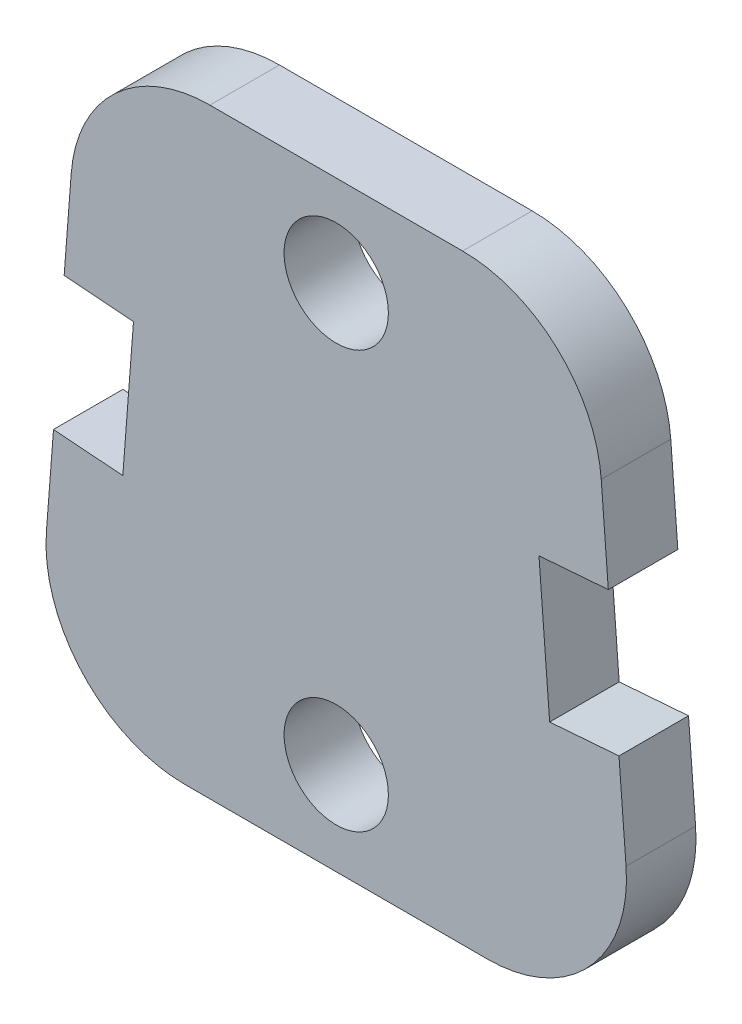
ISO-10303-21;
HEADER;
FILE_DESCRIPTION(('STEP AP214'),'2;1');
FILE_NAME('part.step','',(''),(''),'','','');
FILE_SCHEMA(('AUTOMOTIVE_DESIGN { 1 0 10303 214 1 1 1 1 }'));
ENDSEC;
DATA;
#1=APPLICATION_CONTEXT('core data for automotive mechanical design processes');
#2=APPLICATION_PROTOCOL_DEFINITION('international standard','automotive_design',2000,#1);
#3=PRODUCT_CONTEXT('',#1,'mechanical');
#4=PRODUCT('Part','Part','',(#3));
#5=PRODUCT_RELATED_PRODUCT_CATEGORY('part','',(#4));
#6=PRODUCT_DEFINITION_FORMATION('','',#4);
#7=PRODUCT_DEFINITION_CONTEXT('part definition',#1,'design');
#8=PRODUCT_DEFINITION('design','',#6,#7);
#9=PRODUCT_DEFINITION_SHAPE('','',#8);
#10=(LENGTH_UNIT() NAMED_UNIT(*) SI_UNIT(.MILLI.,.METRE.));
#11=(NAMED_UNIT(*) PLANE_ANGLE_UNIT() SI_UNIT($,.RADIAN.));
#12=(NAMED_UNIT(*) SI_UNIT($,.STERADIAN.) SOLID_ANGLE_UNIT());
#13=UNCERTAINTY_MEASURE_WITH_UNIT(LENGTH_MEASURE(1.E-05),#10,'distance_accuracy_value','');
#14=(GEOMETRIC_REPRESENTATION_CONTEXT(3) GLOBAL_UNCERTAINTY_ASSIGNED_CONTEXT((#13)) GLOBAL_UNIT_ASSIGNED_CONTEXT((#10,
#11,#12)) REPRESENTATION_CONTEXT('',''));
#15=CARTESIAN_POINT('',(0.,0.,0.));
#16=DIRECTION('',(0.,0.,1.));
#17=DIRECTION('',(1.,0.,0.));
#18=AXIS2_PLACEMENT_3D('',#15,#16,#17);
#19=CARTESIAN_POINT('',(-15.7816176470588,1.21397058823529,3.175));
#20=DIRECTION('',(-0.997054485501582,0.076696498884737,0.));
#21=DIRECTION('',(-0.076696498884737,-0.997054485501582,0.));
#22=AXIS2_PLACEMENT_3D('',#19,#20,#21);
#23=PLANE('',#22);
#24=DIRECTION('',(0.0766964988847371,0.997054485501582,0.));
#25=VECTOR('',#24,1.);
#26=CARTESIAN_POINT('',(-15.7816176470588,1.21397058823529,3.175));
#27=LINE('',#26,#25);
#28=CARTESIAN_POINT('',(-13.2324085050319,34.3536894345848,3.175));
#29=VERTEX_POINT('',#28);
#30=CARTESIAN_POINT('',(-12.9093045043756,38.5540414431172,3.175));
#31=VERTEX_POINT('',#30);
#32=EDGE_CURVE('E208',#29,#31,#27,.T.);
#33=ORIENTED_EDGE('',*,*,#32,.T.);
#34=DIRECTION('',(0.,0.,-1.));
#35=VECTOR('',#34,1.);
#36=CARTESIAN_POINT('',(-12.9093045043756,38.5540414431172,3.175));
#37=LINE('',#36,#35);
#38=CARTESIAN_POINT('',(-12.9093045043756,38.5540414431172,0.));
#39=VERTEX_POINT('',#38);
#40=EDGE_CURVE('E160',#31,#39,#37,.T.);
#41=ORIENTED_EDGE('',*,*,#40,.T.);
#42=DIRECTION('',(0.0766964988847371,0.997054485501582,0.));
#43=VECTOR('',#42,1.);
#44=CARTESIAN_POINT('',(-15.7816176470588,1.21397058823529,0.));
#45=LINE('',#44,#43);
#46=CARTESIAN_POINT('',(-13.2324085050319,34.3536894345848,0.));
#47=VERTEX_POINT('',#46);
#48=EDGE_CURVE('E239',#47,#39,#45,.T.);
#49=ORIENTED_EDGE('',*,*,#48,.F.);
#50=DIRECTION('',(0.,0.,-1.));
#51=VECTOR('',#50,1.);
#52=CARTESIAN_POINT('',(-13.2324085050319,34.3536894345848,3.175));
#53=LINE('',#52,#51);
#54=EDGE_CURVE('E268',#29,#47,#53,.T.);
#55=ORIENTED_EDGE('',*,*,#54,.F.);
#56=EDGE_LOOP('',(#33,#41,#49,#55));
#57=FACE_BOUND('',#56,.T.);
#58=ADVANCED_FACE('F33',(#57),#23,.T.);
#59=CARTESIAN_POINT('',(15.7816176470588,1.21397058823529,3.175));
#60=DIRECTION('',(0.997054485501582,0.0766964988847369,0.));
#61=DIRECTION('',(-0.0766964988847369,0.997054485501582,0.));
#62=AXIS2_PLACEMENT_3D('',#59,#60,#61);
#63=PLANE('',#62);
#64=DIRECTION('',(0.0766964988847369,-0.997054485501582,0.));
#65=VECTOR('',#64,1.);
#66=CARTESIAN_POINT('',(15.7816176470588,1.21397058823529,0.));
#67=LINE('',#66,#65);
#68=CARTESIAN_POINT('',(12.909304504375,38.5540414431171,0.));
#69=VERTEX_POINT('',#68);
#70=CARTESIAN_POINT('',(13.2324085050319,34.3536894345848,0.));
#71=VERTEX_POINT('',#70);
#72=EDGE_CURVE('E251',#69,#71,#67,.T.);
#73=ORIENTED_EDGE('',*,*,#72,.F.);
#74=DIRECTION('',(0.,0.,-1.));
#75=VECTOR('',#74,1.);
#76=CARTESIAN_POINT('',(12.909304504375,38.5540414431171,3.17500000000002));
#77=LINE('',#76,#75);
#78=CARTESIAN_POINT('',(12.909304504375,38.5540414431171,3.17500000000002));
#79=VERTEX_POINT('',#78);
#80=EDGE_CURVE('E177',#79,#69,#77,.T.);
#81=ORIENTED_EDGE('',*,*,#80,.F.);
#82=DIRECTION('',(0.0766964988847369,-0.997054485501582,0.));
#83=VECTOR('',#82,1.);
#84=CARTESIAN_POINT('',(15.7816176470588,1.21397058823529,3.175));
#85=LINE('',#84,#83);
#86=CARTESIAN_POINT('',(13.2324085050319,34.3536894345848,3.175));
#87=VERTEX_POINT('',#86);
#88=EDGE_CURVE('E220',#79,#87,#85,.T.);
#89=ORIENTED_EDGE('',*,*,#88,.T.);
#90=DIRECTION('',(0.,0.,-1.));
#91=VECTOR('',#90,1.);
#92=CARTESIAN_POINT('',(13.2324085050319,34.3536894345848,3.175));
#93=LINE('',#92,#91);
#94=EDGE_CURVE('E260',#87,#71,#93,.T.);
#95=ORIENTED_EDGE('',*,*,#94,.T.);
#96=EDGE_LOOP('',(#73,#81,#89,#95));
#97=FACE_BOUND('',#96,.T.);
#98=ADVANCED_FACE('F296',(#97),#63,.T.);
#99=CARTESIAN_POINT('',(0.,54.9486666666667,3.175));
#100=DIRECTION('',(0.,1.,0.));
#101=DIRECTION('',(-1.,0.,0.));
#102=AXIS2_PLACEMENT_3D('',#99,#100,#101);
#103=PLANE('',#102);
#104=DIRECTION('',(1.,0.,0.));
#105=VECTOR('',#104,1.);
#106=CARTESIAN_POINT('',(0.,54.9486666666667,0.));
#107=LINE('',#106,#105);
#108=CARTESIAN_POINT('',(-5.76788175286608,54.9486666666667,0.));
#109=VERTEX_POINT('',#108);
#110=CARTESIAN_POINT('',(5.7678817528661,54.9486666666667,0.));
#111=VERTEX_POINT('',#110);
#112=EDGE_CURVE('E232',#109,#111,#107,.T.);
#113=ORIENTED_EDGE('',*,*,#112,.F.);
#114=DIRECTION('',(0.,0.,-1.));
#115=VECTOR('',#114,1.);
#116=CARTESIAN_POINT('',(-5.76788175286608,54.9486666666667,3.175));
#117=LINE('',#116,#115);
#118=CARTESIAN_POINT('',(-5.76788175286608,54.9486666666667,3.175));
#119=VERTEX_POINT('',#118);
#120=EDGE_CURVE('E273',#119,#109,#117,.T.);
#121=ORIENTED_EDGE('',*,*,#120,.F.);
#122=DIRECTION('',(1.,0.,0.));
#123=VECTOR('',#122,1.);
#124=CARTESIAN_POINT('',(0.,54.9486666666667,3.175));
#125=LINE('',#124,#123);
#126=CARTESIAN_POINT('',(5.7678817528661,54.9486666666667,3.175));
#127=VERTEX_POINT('',#126);
#128=EDGE_CURVE('E203',#119,#127,#125,.T.);
#129=ORIENTED_EDGE('',*,*,#128,.T.);
#130=DIRECTION('',(0.,0.,-1.));
#131=VECTOR('',#130,1.);
#132=CARTESIAN_POINT('',(5.7678817528661,54.9486666666667,3.175));
#133=LINE('',#132,#131);
#134=EDGE_CURVE('E226',#127,#111,#133,.T.);
#135=ORIENTED_EDGE('',*,*,#134,.T.);
#136=EDGE_LOOP('',(#113,#121,#129,#135));
#137=FACE_BOUND('',#136,.T.);
#138=ADVANCED_FACE('F328',(#137),#103,.T.);
#139=CARTESIAN_POINT('',(-5.76788175286613,48.5986666666667,3.175));
#140=DIRECTION('',(0.,0.,-1.));
#141=DIRECTION('',(-1.,0.,0.));
#142=AXIS2_PLACEMENT_3D('',#139,#140,#141);
#143=CYLINDRICAL_SURFACE('',#142,6.35);
#144=CARTESIAN_POINT('',(-5.76788175286613,48.5986666666667,0.));
#145=DIRECTION('',(0.,0.,1.));
#146=DIRECTION('',(1.,0.,0.));
#147=AXIS2_PLACEMENT_3D('',#144,#145,#146);
#148=CIRCLE('',#147,6.35);
#149=CARTESIAN_POINT('',(-12.0991777358012,49.0856894345847,0.));
#150=VERTEX_POINT('',#149);
#151=EDGE_CURVE('E235',#109,#150,#148,.T.);
#152=ORIENTED_EDGE('',*,*,#151,.T.);
#153=DIRECTION('',(0.,0.,-1.));
#154=VECTOR('',#153,1.);
#155=CARTESIAN_POINT('',(-12.0991777358012,49.0856894345847,3.175));
#156=LINE('',#155,#154);
#157=CARTESIAN_POINT('',(-12.0991777358012,49.0856894345847,3.175));
#158=VERTEX_POINT('',#157);
#159=EDGE_CURVE('E270',#158,#150,#156,.T.);
#160=ORIENTED_EDGE('',*,*,#159,.F.);
#161=CARTESIAN_POINT('',(-5.76788175286613,48.5986666666667,3.175));
#162=DIRECTION('',(0.,0.,1.));
#163=DIRECTION('',(1.,0.,0.));
#164=AXIS2_PLACEMENT_3D('',#161,#162,#163);
#165=CIRCLE('',#164,6.35);
#166=EDGE_CURVE('E206',#119,#158,#165,.T.);
#167=ORIENTED_EDGE('',*,*,#166,.F.);
#168=ORIENTED_EDGE('',*,*,#120,.T.);
#169=EDGE_LOOP('',(#152,#160,#167,#168));
#170=FACE_BOUND('',#169,.T.);
#171=ADVANCED_FACE('F325',(#170),#143,.T.);
#172=DIRECTION('',(0.,0.,-1.));
#173=VECTOR('',#172,1.);
#174=CARTESIAN_POINT('',(-12.4222817364575,44.8853374260523,3.175));
#175=LINE('',#174,#173);
#176=CARTESIAN_POINT('',(-12.4222817364575,44.8853374260523,3.175));
#177=VERTEX_POINT('',#176);
#178=CARTESIAN_POINT('',(-12.4222817364575,44.8853374260523,0.));
#179=VERTEX_POINT('',#178);
#180=EDGE_CURVE('E317',#177,#179,#175,.T.);
#181=ORIENTED_EDGE('',*,*,#180,.F.);
#182=EDGE_CURVE('E166',#177,#158,#27,.T.);
#183=ORIENTED_EDGE('',*,*,#182,.T.);
#184=ORIENTED_EDGE('',*,*,#159,.T.);
#185=EDGE_CURVE('E238',#179,#150,#45,.T.);
#186=ORIENTED_EDGE('',*,*,#185,.F.);
#187=EDGE_LOOP('',(#181,#183,#184,#186));
#188=FACE_BOUND('',#187,.T.);
#189=ADVANCED_FACE('F321',(#188),#23,.T.);
#190=CARTESIAN_POINT('',(-6.9011125220969,33.8666666666667,3.175));
#191=DIRECTION('',(0.,0.,-1.));
#192=DIRECTION('',(-1.,0.,0.));
#193=AXIS2_PLACEMENT_3D('',#190,#191,#192);
#194=CYLINDRICAL_SURFACE('',#193,6.35);
#195=CARTESIAN_POINT('',(-6.9011125220969,33.8666666666667,0.));
#196=DIRECTION('',(0.,0.,1.));
#197=DIRECTION('',(1.,0.,0.));
#198=AXIS2_PLACEMENT_3D('',#195,#196,#197);
#199=CIRCLE('',#198,6.35);
#200=CARTESIAN_POINT('',(-6.90111252209685,27.5166666666667,0.));
#201=VERTEX_POINT('',#200);
#202=EDGE_CURVE('E242',#201,#47,#199,.F.);
#203=ORIENTED_EDGE('',*,*,#202,.F.);
#204=DIRECTION('',(0.,0.,-1.));
#205=VECTOR('',#204,1.);
#206=CARTESIAN_POINT('',(-6.90111252209685,27.5166666666667,3.175));
#207=LINE('',#206,#205);
#208=CARTESIAN_POINT('',(-6.90111252209685,27.5166666666667,3.175));
#209=VERTEX_POINT('',#208);
#210=EDGE_CURVE('E266',#209,#201,#207,.T.);
#211=ORIENTED_EDGE('',*,*,#210,.F.);
#212=CARTESIAN_POINT('',(-6.9011125220969,33.8666666666667,3.175));
#213=DIRECTION('',(0.,0.,1.));
#214=DIRECTION('',(1.,0.,0.));
#215=AXIS2_PLACEMENT_3D('',#212,#213,#214);
#216=CIRCLE('',#215,6.35);
#217=EDGE_CURVE('E211',#209,#29,#216,.F.);
#218=ORIENTED_EDGE('',*,*,#217,.T.);
#219=ORIENTED_EDGE('',*,*,#54,.T.);
#220=EDGE_LOOP('',(#203,#211,#218,#219));
#221=FACE_BOUND('',#220,.T.);
#222=ADVANCED_FACE('F305',(#221),#194,.T.);
#223=CARTESIAN_POINT('',(0.,27.5166666666667,3.175));
#224=DIRECTION('',(0.,1.,0.));
#225=DIRECTION('',(-1.,0.,0.));
#226=AXIS2_PLACEMENT_3D('',#223,#224,#225);
#227=PLANE('',#226);
#228=DIRECTION('',(1.,0.,0.));
#229=VECTOR('',#228,1.);
#230=CARTESIAN_POINT('',(0.,27.5166666666667,0.));
#231=LINE('',#230,#229);
#232=CARTESIAN_POINT('',(6.90111252209686,27.5166666666667,0.));
#233=VERTEX_POINT('',#232);
#234=EDGE_CURVE('E245',#201,#233,#231,.T.);
#235=ORIENTED_EDGE('',*,*,#234,.T.);
#236=DIRECTION('',(0.,0.,-1.));
#237=VECTOR('',#236,1.);
#238=CARTESIAN_POINT('',(6.90111252209686,27.5166666666667,3.175));
#239=LINE('',#238,#237);
#240=CARTESIAN_POINT('',(6.90111252209686,27.5166666666667,3.175));
#241=VERTEX_POINT('',#240);
#242=EDGE_CURVE('E263',#241,#233,#239,.T.);
#243=ORIENTED_EDGE('',*,*,#242,.F.);
#244=DIRECTION('',(1.,0.,0.));
#245=VECTOR('',#244,1.);
#246=CARTESIAN_POINT('',(0.,27.5166666666667,3.175));
#247=LINE('',#246,#245);
#248=EDGE_CURVE('E214',#209,#241,#247,.T.);
#249=ORIENTED_EDGE('',*,*,#248,.F.);
#250=ORIENTED_EDGE('',*,*,#210,.T.);
#251=EDGE_LOOP('',(#235,#243,#249,#250));
#252=FACE_BOUND('',#251,.T.);
#253=ADVANCED_FACE('F356',(#252),#227,.F.);
#254=CARTESIAN_POINT('',(6.9011125220969,33.8666666666667,3.175));
#255=DIRECTION('',(0.,0.,-1.));
#256=DIRECTION('',(-1.,0.,0.));
#257=AXIS2_PLACEMENT_3D('',#254,#255,#256);
#258=CYLINDRICAL_SURFACE('',#257,6.35);
#259=CARTESIAN_POINT('',(6.9011125220969,33.8666666666667,0.));
#260=DIRECTION('',(0.,0.,1.));
#261=DIRECTION('',(1.,0.,0.));
#262=AXIS2_PLACEMENT_3D('',#259,#260,#261);
#263=CIRCLE('',#262,6.35);
#264=EDGE_CURVE('E248',#233,#71,#263,.T.);
#265=ORIENTED_EDGE('',*,*,#264,.T.);
#266=ORIENTED_EDGE('',*,*,#94,.F.);
#267=CARTESIAN_POINT('',(6.9011125220969,33.8666666666667,3.175));
#268=DIRECTION('',(0.,0.,1.));
#269=DIRECTION('',(1.,0.,0.));
#270=AXIS2_PLACEMENT_3D('',#267,#268,#269);
#271=CIRCLE('',#270,6.35);
#272=EDGE_CURVE('E217',#241,#87,#271,.T.);
#273=ORIENTED_EDGE('',*,*,#272,.F.);
#274=ORIENTED_EDGE('',*,*,#242,.T.);
#275=EDGE_LOOP('',(#265,#266,#273,#274));
#276=FACE_BOUND('',#275,.T.);
#277=ADVANCED_FACE('F299',(#276),#258,.T.);
#278=DIRECTION('',(0.,0.,-1.));
#279=VECTOR('',#278,1.);
#280=CARTESIAN_POINT('',(12.4222817364569,44.8853374260521,3.17500000000002));
#281=LINE('',#280,#279);
#282=CARTESIAN_POINT('',(12.4222817364569,44.8853374260521,3.17500000000002));
#283=VERTEX_POINT('',#282);
#284=CARTESIAN_POINT('',(12.4222817364569,44.8853374260521,0.));
#285=VERTEX_POINT('',#284);
#286=EDGE_CURVE('E174',#283,#285,#281,.T.);
#287=ORIENTED_EDGE('',*,*,#286,.T.);
#288=CARTESIAN_POINT('',(12.0991777358012,49.0856894345847,0.));
#289=VERTEX_POINT('',#288);
#290=EDGE_CURVE('E252',#289,#285,#67,.T.);
#291=ORIENTED_EDGE('',*,*,#290,.F.);
#292=DIRECTION('',(0.,0.,-1.));
#293=VECTOR('',#292,1.);
#294=CARTESIAN_POINT('',(12.0991777358012,49.0856894345847,3.175));
#295=LINE('',#294,#293);
#296=CARTESIAN_POINT('',(12.0991777358012,49.0856894345847,3.175));
#297=VERTEX_POINT('',#296);
#298=EDGE_CURVE('E258',#297,#289,#295,.T.);
#299=ORIENTED_EDGE('',*,*,#298,.F.);
#300=EDGE_CURVE('E221',#297,#283,#85,.T.);
#301=ORIENTED_EDGE('',*,*,#300,.T.);
#302=EDGE_LOOP('',(#287,#291,#299,#301));
#303=FACE_BOUND('',#302,.T.);
#304=ADVANCED_FACE('F287',(#303),#63,.T.);
#305=CARTESIAN_POINT('',(0.,50.7999999576667,3.175));
#306=DIRECTION('',(0.,0.,-1.));
#307=DIRECTION('',(-1.,0.,0.));
#308=AXIS2_PLACEMENT_3D('',#305,#306,#307);
#309=CYLINDRICAL_SURFACE('',#308,2.38125);
#310=CARTESIAN_POINT('',(0.,50.7999999576667,3.175));
#311=DIRECTION('',(0.,0.,1.));
#312=DIRECTION('',(1.,0.,0.));
#313=AXIS2_PLACEMENT_3D('',#310,#311,#312);
#314=CIRCLE('',#313,2.38125);
#315=CARTESIAN_POINT('',(2.38125,50.7999999576667,3.175));
#316=VERTEX_POINT('',#315);
#317=EDGE_CURVE('E199',#316,#316,#314,.T.);
#318=ORIENTED_EDGE('',*,*,#317,.T.);
#319=EDGE_LOOP('',(#318));
#320=FACE_BOUND('',#319,.T.);
#321=CARTESIAN_POINT('',(0.,50.7999999576667,0.));
#322=DIRECTION('',(0.,0.,1.));
#323=DIRECTION('',(1.,0.,0.));
#324=AXIS2_PLACEMENT_3D('',#321,#322,#323);
#325=CIRCLE('',#324,2.38125);
#326=CARTESIAN_POINT('',(2.38125,50.7999999576667,0.));
#327=VERTEX_POINT('',#326);
#328=EDGE_CURVE('E229',#327,#327,#325,.T.);
#329=ORIENTED_EDGE('',*,*,#328,.F.);
#330=EDGE_LOOP('',(#329));
#331=FACE_BOUND('',#330,.T.);
#332=ADVANCED_FACE('F340',(#320,#331),#309,.F.);
#333=CARTESIAN_POINT('',(0.,31.7499999576667,3.175));
#334=DIRECTION('',(0.,0.,-1.));
#335=DIRECTION('',(-1.,0.,0.));
#336=AXIS2_PLACEMENT_3D('',#333,#334,#335);
#337=CYLINDRICAL_SURFACE('',#336,2.38125);
#338=CARTESIAN_POINT('',(0.,31.7499999576667,3.175));
#339=DIRECTION('',(0.,0.,1.));
#340=DIRECTION('',(1.,0.,0.));
#341=AXIS2_PLACEMENT_3D('',#338,#339,#340);
#342=CIRCLE('',#341,2.38125);
#343=CARTESIAN_POINT('',(2.38125,31.7499999576667,3.175));
#344=VERTEX_POINT('',#343);
#345=EDGE_CURVE('E196',#344,#344,#342,.T.);
#346=ORIENTED_EDGE('',*,*,#345,.T.);
#347=EDGE_LOOP('',(#346));
#348=FACE_BOUND('',#347,.T.);
#349=CARTESIAN_POINT('',(0.,31.7499999576667,0.));
#350=DIRECTION('',(0.,0.,1.));
#351=DIRECTION('',(1.,0.,0.));
#352=AXIS2_PLACEMENT_3D('',#349,#350,#351);
#353=CIRCLE('',#352,2.38125);
#354=CARTESIAN_POINT('',(2.38125,31.7499999576667,0.));
#355=VERTEX_POINT('',#354);
#356=EDGE_CURVE('E195',#355,#355,#353,.T.);
#357=ORIENTED_EDGE('',*,*,#356,.F.);
#358=EDGE_LOOP('',(#357));
#359=FACE_BOUND('',#358,.T.);
#360=ADVANCED_FACE('F35',(#348,#359),#337,.F.);
#361=CARTESIAN_POINT('',(5.76788175286614,48.5986666666667,3.175));
#362=DIRECTION('',(0.,0.,-1.));
#363=DIRECTION('',(-1.,0.,0.));
#364=AXIS2_PLACEMENT_3D('',#361,#362,#363);
#365=CYLINDRICAL_SURFACE('',#364,6.35);
#366=CARTESIAN_POINT('',(5.76788175286614,48.5986666666667,0.));
#367=DIRECTION('',(0.,0.,1.));
#368=DIRECTION('',(1.,0.,0.));
#369=AXIS2_PLACEMENT_3D('',#366,#367,#368);
#370=CIRCLE('',#369,6.35);
#371=EDGE_CURVE('E200',#289,#111,#370,.T.);
#372=ORIENTED_EDGE('',*,*,#371,.T.);
#373=ORIENTED_EDGE('',*,*,#134,.F.);
#374=CARTESIAN_POINT('',(5.76788175286614,48.5986666666667,3.175));
#375=DIRECTION('',(0.,0.,1.));
#376=DIRECTION('',(1.,0.,0.));
#377=AXIS2_PLACEMENT_3D('',#374,#375,#376);
#378=CIRCLE('',#377,6.35);
#379=EDGE_CURVE('E224',#297,#127,#378,.T.);
#380=ORIENTED_EDGE('',*,*,#379,.F.);
#381=ORIENTED_EDGE('',*,*,#298,.T.);
#382=EDGE_LOOP('',(#372,#373,#380,#381));
#383=FACE_BOUND('',#382,.T.);
#384=ADVANCED_FACE('F332',(#383),#365,.T.);
#385=CARTESIAN_POINT('',(0.,0.,3.175));
#386=DIRECTION('',(0.,0.,1.));
#387=DIRECTION('',(1.,0.,0.));
#388=AXIS2_PLACEMENT_3D('',#385,#386,#387);
#389=PLANE('',#388);
#390=DIRECTION('',(-0.997054485501582,0.0766964988847371,0.));
#391=VECTOR('',#390,1.);
#392=CARTESIAN_POINT('',(-9.25663374498998,44.6418260420932,3.175));
#393=LINE('',#392,#391);
#394=CARTESIAN_POINT('',(-9.25663374498998,44.6418260420932,3.175));
#395=VERTEX_POINT('',#394);
#396=EDGE_CURVE('E157',#395,#177,#393,.T.);
#397=ORIENTED_EDGE('',*,*,#396,.F.);
#398=DIRECTION('',(0.0766964988847371,0.997054485501582,0.));
#399=VECTOR('',#398,1.);
#400=CARTESIAN_POINT('',(-12.6159696555913,0.970459204276254,3.175));
#401=LINE('',#400,#399);
#402=CARTESIAN_POINT('',(-9.74365651290806,38.3105300591582,3.175));
#403=VERTEX_POINT('',#402);
#404=EDGE_CURVE('E145',#403,#395,#401,.T.);
#405=ORIENTED_EDGE('',*,*,#404,.F.);
#406=DIRECTION('',(-0.997054485501582,0.0766964988847371,0.));
#407=VECTOR('',#406,1.);
#408=CARTESIAN_POINT('',(-9.74365651290806,38.3105300591582,3.175));
#409=LINE('',#408,#407);
#410=EDGE_CURVE('E167',#403,#31,#409,.T.);
#411=ORIENTED_EDGE('',*,*,#410,.T.);
#412=ORIENTED_EDGE('',*,*,#32,.F.);
#413=ORIENTED_EDGE('',*,*,#217,.F.);
#414=ORIENTED_EDGE('',*,*,#248,.T.);
#415=ORIENTED_EDGE('',*,*,#272,.T.);
#416=ORIENTED_EDGE('',*,*,#88,.F.);
#417=DIRECTION('',(-0.997054485501581,-0.0766964988847402,0.));
#418=VECTOR('',#417,1.);
#419=CARTESIAN_POINT('',(12.909304504375,38.5540414431171,3.17500000000002));
#420=LINE('',#419,#418);
#421=CARTESIAN_POINT('',(9.74365651290745,38.310530059158,3.17500000000002));
#422=VERTEX_POINT('',#421);
#423=EDGE_CURVE('E184',#79,#422,#420,.T.);
#424=ORIENTED_EDGE('',*,*,#423,.T.);
#425=DIRECTION('',(-0.0766964988847402,0.997054485501581,0.));
#426=VECTOR('',#425,1.);
#427=CARTESIAN_POINT('',(12.6159696555908,0.970459204276254,3.175));
#428=LINE('',#427,#426);
#429=CARTESIAN_POINT('',(9.25663374498935,44.6418260420931,3.17500000000002));
#430=VERTEX_POINT('',#429);
#431=EDGE_CURVE('E192',#422,#430,#428,.T.);
#432=ORIENTED_EDGE('',*,*,#431,.T.);
#433=DIRECTION('',(-0.997054485501581,-0.0766964988847402,0.));
#434=VECTOR('',#433,1.);
#435=CARTESIAN_POINT('',(12.4222817364569,44.8853374260521,3.17500000000002));
#436=LINE('',#435,#434);
#437=EDGE_CURVE('E187',#283,#430,#436,.T.);
#438=ORIENTED_EDGE('',*,*,#437,.F.);
#439=ORIENTED_EDGE('',*,*,#300,.F.);
#440=ORIENTED_EDGE('',*,*,#379,.T.);
#441=ORIENTED_EDGE('',*,*,#128,.F.);
#442=ORIENTED_EDGE('',*,*,#166,.T.);
#443=ORIENTED_EDGE('',*,*,#182,.F.);
#444=EDGE_LOOP('',(#397,#405,#411,#412,#413,#414,#415,#416,#424,#432,#438,#439,#440,#441,#442,#443));
#445=FACE_BOUND('',#444,.T.);
#446=ORIENTED_EDGE('',*,*,#345,.F.);
#447=EDGE_LOOP('',(#446));
#448=FACE_BOUND('',#447,.T.);
#449=ORIENTED_EDGE('',*,*,#317,.F.);
#450=EDGE_LOOP('',(#449));
#451=FACE_BOUND('',#450,.T.);
#452=ADVANCED_FACE('F163',(#445,#448,#451),#389,.T.);
#453=CARTESIAN_POINT('',(0.,0.,0.));
#454=DIRECTION('',(0.,0.,1.));
#455=DIRECTION('',(1.,0.,0.));
#456=AXIS2_PLACEMENT_3D('',#453,#454,#455);
#457=PLANE('',#456);
#458=ORIENTED_EDGE('',*,*,#202,.T.);
#459=ORIENTED_EDGE('',*,*,#48,.T.);
#460=DIRECTION('',(-0.997054485501582,0.0766964988847371,0.));
#461=VECTOR('',#460,1.);
#462=CARTESIAN_POINT('',(-9.74365651290806,38.3105300591582,0.));
#463=LINE('',#462,#461);
#464=CARTESIAN_POINT('',(-9.74365651290806,38.3105300591582,0.));
#465=VERTEX_POINT('',#464);
#466=EDGE_CURVE('E170',#465,#39,#463,.T.);
#467=ORIENTED_EDGE('',*,*,#466,.F.);
#468=DIRECTION('',(0.0766964988847371,0.997054485501582,0.));
#469=VECTOR('',#468,1.);
#470=CARTESIAN_POINT('',(-12.6159696555913,0.970459204276254,0.));
#471=LINE('',#470,#469);
#472=CARTESIAN_POINT('',(-9.25663374498998,44.6418260420932,0.));
#473=VERTEX_POINT('',#472);
#474=EDGE_CURVE('E11',#465,#473,#471,.T.);
#475=ORIENTED_EDGE('',*,*,#474,.T.);
#476=DIRECTION('',(-0.997054485501582,0.0766964988847371,0.));
#477=VECTOR('',#476,1.);
#478=CARTESIAN_POINT('',(-9.25663374498998,44.6418260420932,0.));
#479=LINE('',#478,#477);
#480=EDGE_CURVE('E153',#473,#179,#479,.T.);
#481=ORIENTED_EDGE('',*,*,#480,.T.);
#482=ORIENTED_EDGE('',*,*,#185,.T.);
#483=ORIENTED_EDGE('',*,*,#151,.F.);
#484=ORIENTED_EDGE('',*,*,#112,.T.);
#485=ORIENTED_EDGE('',*,*,#371,.F.);
#486=ORIENTED_EDGE('',*,*,#290,.T.);
#487=DIRECTION('',(-0.997054485501581,-0.0766964988847402,0.));
#488=VECTOR('',#487,1.);
#489=CARTESIAN_POINT('',(12.4222817364569,44.8853374260521,0.));
#490=LINE('',#489,#488);
#491=CARTESIAN_POINT('',(9.25663374498935,44.6418260420931,0.));
#492=VERTEX_POINT('',#491);
#493=EDGE_CURVE('E189',#285,#492,#490,.T.);
#494=ORIENTED_EDGE('',*,*,#493,.T.);
#495=DIRECTION('',(-0.0766964988847402,0.997054485501581,0.));
#496=VECTOR('',#495,1.);
#497=CARTESIAN_POINT('',(12.6159696555908,0.970459204276254,0.));
#498=LINE('',#497,#496);
#499=CARTESIAN_POINT('',(9.74365651290745,38.310530059158,0.));
#500=VERTEX_POINT('',#499);
#501=EDGE_CURVE('E41',#500,#492,#498,.T.);
#502=ORIENTED_EDGE('',*,*,#501,.F.);
#503=DIRECTION('',(-0.997054485501581,-0.0766964988847402,0.));
#504=VECTOR('',#503,1.);
#505=CARTESIAN_POINT('',(12.909304504375,38.5540414431171,0.));
#506=LINE('',#505,#504);
#507=EDGE_CURVE('E179',#69,#500,#506,.T.);
#508=ORIENTED_EDGE('',*,*,#507,.F.);
#509=ORIENTED_EDGE('',*,*,#72,.T.);
#510=ORIENTED_EDGE('',*,*,#264,.F.);
#511=ORIENTED_EDGE('',*,*,#234,.F.);
#512=EDGE_LOOP('',(#458,#459,#467,#475,#481,#482,#483,#484,#485,#486,#494,#502,#508,#509,#510,#511));
#513=FACE_BOUND('',#512,.T.);
#514=ORIENTED_EDGE('',*,*,#356,.T.);
#515=EDGE_LOOP('',(#514));
#516=FACE_BOUND('',#515,.T.);
#517=ORIENTED_EDGE('',*,*,#328,.T.);
#518=EDGE_LOOP('',(#517));
#519=FACE_BOUND('',#518,.T.);
#520=ADVANCED_FACE('F282',(#513,#516,#519),#457,.F.);
#521=CARTESIAN_POINT('',(9.37797064917215,43.0644462877168,10.6681578444962));
#522=DIRECTION('',(0.997054485501581,0.0766964988847402,0.));
#523=DIRECTION('',(0.,0.,-1.));
#524=AXIS2_PLACEMENT_3D('',#521,#522,#523);
#525=PLANE('',#524);
#526=DIRECTION('',(0.,0.,-1.));
#527=VECTOR('',#526,1.);
#528=CARTESIAN_POINT('',(9.74365651290745,38.310530059158,3.17500000000002));
#529=LINE('',#528,#527);
#530=EDGE_CURVE('E56',#422,#500,#529,.T.);
#531=ORIENTED_EDGE('',*,*,#530,.T.);
#532=ORIENTED_EDGE('',*,*,#501,.T.);
#533=DIRECTION('',(0.,0.,-1.));
#534=VECTOR('',#533,1.);
#535=CARTESIAN_POINT('',(9.25663374498935,44.6418260420931,3.17500000000002));
#536=LINE('',#535,#534);
#537=EDGE_CURVE('E152',#430,#492,#536,.T.);
#538=ORIENTED_EDGE('',*,*,#537,.F.);
#539=ORIENTED_EDGE('',*,*,#431,.F.);
#540=EDGE_LOOP('',(#531,#532,#538,#539));
#541=FACE_BOUND('',#540,.T.);
#542=ADVANCED_FACE('F276',(#541),#525,.T.);
#543=CARTESIAN_POINT('',(12.4222817364569,44.8853374260521,3.17500000000002));
#544=DIRECTION('',(-0.0766964988847402,0.997054485501581,0.));
#545=DIRECTION('',(-0.997054485501581,-0.0766964988847402,0.));
#546=AXIS2_PLACEMENT_3D('',#543,#544,#545);
#547=PLANE('',#546);
#548=ORIENTED_EDGE('',*,*,#537,.T.);
#549=ORIENTED_EDGE('',*,*,#493,.F.);
#550=ORIENTED_EDGE('',*,*,#286,.F.);
#551=ORIENTED_EDGE('',*,*,#437,.T.);
#552=EDGE_LOOP('',(#548,#549,#550,#551));
#553=FACE_BOUND('',#552,.T.);
#554=ADVANCED_FACE('F280',(#553),#547,.F.);
#555=CARTESIAN_POINT('',(12.909304504375,38.5540414431171,3.17500000000002));
#556=DIRECTION('',(-0.0766964988847402,0.997054485501581,0.));
#557=DIRECTION('',(-0.997054485501581,-0.0766964988847402,0.));
#558=AXIS2_PLACEMENT_3D('',#555,#556,#557);
#559=PLANE('',#558);
#560=ORIENTED_EDGE('',*,*,#530,.F.);
#561=ORIENTED_EDGE('',*,*,#423,.F.);
#562=ORIENTED_EDGE('',*,*,#80,.T.);
#563=ORIENTED_EDGE('',*,*,#507,.T.);
#564=EDGE_LOOP('',(#560,#561,#562,#563));
#565=FACE_BOUND('',#564,.T.);
#566=ADVANCED_FACE('F292',(#565),#559,.T.);
#567=CARTESIAN_POINT('',(-9.37797064917277,43.0644462877169,10.6681578444962));
#568=DIRECTION('',(0.997054485501582,-0.0766964988847371,0.));
#569=DIRECTION('',(0.,0.,-1.));
#570=AXIS2_PLACEMENT_3D('',#567,#568,#569);
#571=PLANE('',#570);
#572=ORIENTED_EDGE('',*,*,#404,.T.);
#573=DIRECTION('',(0.,0.,-1.));
#574=VECTOR('',#573,1.);
#575=CARTESIAN_POINT('',(-9.25663374498998,44.6418260420932,3.175));
#576=LINE('',#575,#574);
#577=EDGE_CURVE('E48',#395,#473,#576,.T.);
#578=ORIENTED_EDGE('',*,*,#577,.T.);
#579=ORIENTED_EDGE('',*,*,#474,.F.);
#580=DIRECTION('',(0.,0.,-1.));
#581=VECTOR('',#580,1.);
#582=CARTESIAN_POINT('',(-9.74365651290806,38.3105300591582,3.175));
#583=LINE('',#582,#581);
#584=EDGE_CURVE('E148',#403,#465,#583,.T.);
#585=ORIENTED_EDGE('',*,*,#584,.F.);
#586=EDGE_LOOP('',(#572,#578,#579,#585));
#587=FACE_BOUND('',#586,.T.);
#588=ADVANCED_FACE('F146',(#587),#571,.F.);
#589=CARTESIAN_POINT('',(-9.25663374498998,44.6418260420932,3.175));
#590=DIRECTION('',(0.076696498884737,0.997054485501582,0.));
#591=DIRECTION('',(-0.997054485501582,0.0766964988847371,0.));
#592=AXIS2_PLACEMENT_3D('',#589,#590,#591);
#593=PLANE('',#592);
#594=ORIENTED_EDGE('',*,*,#180,.T.);
#595=ORIENTED_EDGE('',*,*,#480,.F.);
#596=ORIENTED_EDGE('',*,*,#577,.F.);
#597=ORIENTED_EDGE('',*,*,#396,.T.);
#598=EDGE_LOOP('',(#594,#595,#596,#597));
#599=FACE_BOUND('',#598,.T.);
#600=ADVANCED_FACE('F156',(#599),#593,.F.);
#601=CARTESIAN_POINT('',(-9.74365651290806,38.3105300591582,3.175));
#602=DIRECTION('',(0.076696498884737,0.997054485501582,0.));
#603=DIRECTION('',(-0.997054485501582,0.0766964988847371,0.));
#604=AXIS2_PLACEMENT_3D('',#601,#602,#603);
#605=PLANE('',#604);
#606=ORIENTED_EDGE('',*,*,#40,.F.);
#607=ORIENTED_EDGE('',*,*,#410,.F.);
#608=ORIENTED_EDGE('',*,*,#584,.T.);
#609=ORIENTED_EDGE('',*,*,#466,.T.);
#610=EDGE_LOOP('',(#606,#607,#608,#609));
#611=FACE_BOUND('',#610,.T.);
#612=ADVANCED_FACE('F382',(#611),#605,.T.);
#613=CLOSED_SHELL('',(#58,#98,#138,#171,#189,#222,#253,#277,#304,#332,#360,#384,#452,#520,#542,
#554,#566,#588,#600,#612));
#614=MANIFOLD_SOLID_BREP('B2',#613);
#615=ADVANCED_BREP_SHAPE_REPRESENTATION('',(#18,#614),#14);
#616=SHAPE_DEFINITION_REPRESENTATION(#9,#615);
ENDSEC;
END-ISO-10303-21;
